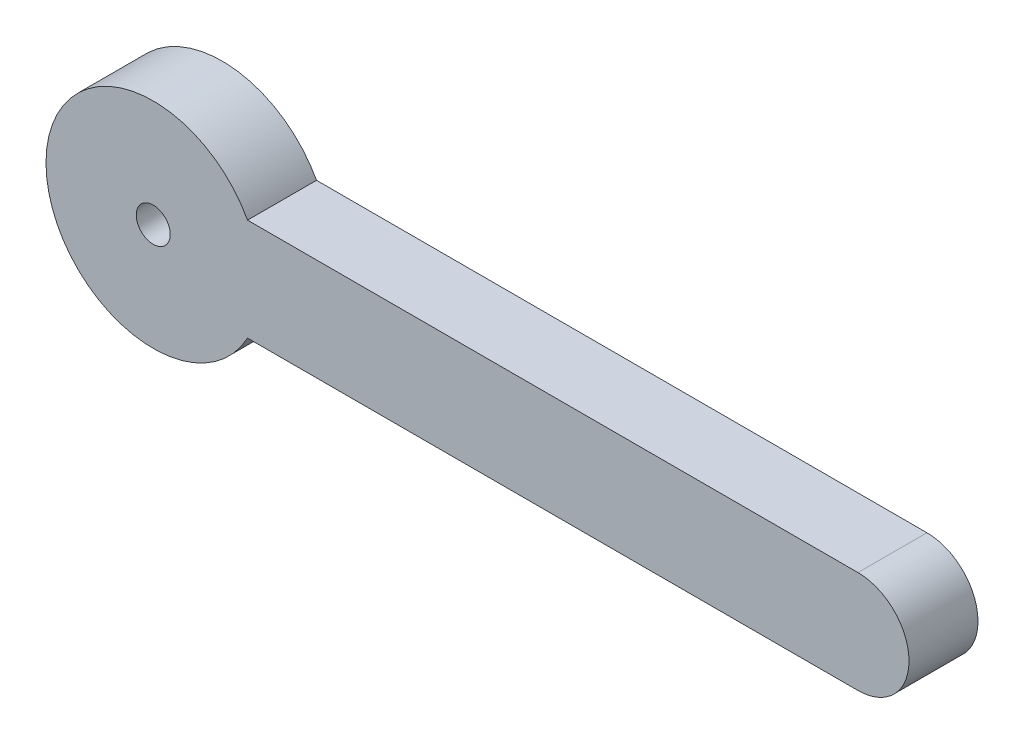
ISO-10303-21;
HEADER;
FILE_DESCRIPTION(('STEP AP214'),'2;1');
FILE_NAME('part.step','',(''),(''),'','','');
FILE_SCHEMA(('AUTOMOTIVE_DESIGN { 1 0 10303 214 1 1 1 1 }'));
ENDSEC;
DATA;
#1=APPLICATION_CONTEXT('core data for automotive mechanical design processes');
#2=APPLICATION_PROTOCOL_DEFINITION('international standard','automotive_design',2000,#1);
#3=PRODUCT_CONTEXT('',#1,'mechanical');
#4=PRODUCT('Part','Part','',(#3));
#5=PRODUCT_RELATED_PRODUCT_CATEGORY('part','',(#4));
#6=PRODUCT_DEFINITION_FORMATION('','',#4);
#7=PRODUCT_DEFINITION_CONTEXT('part definition',#1,'design');
#8=PRODUCT_DEFINITION('design','',#6,#7);
#9=PRODUCT_DEFINITION_SHAPE('','',#8);
#10=(LENGTH_UNIT() NAMED_UNIT(*) SI_UNIT(.MILLI.,.METRE.));
#11=(NAMED_UNIT(*) PLANE_ANGLE_UNIT() SI_UNIT($,.RADIAN.));
#12=(NAMED_UNIT(*) SI_UNIT($,.STERADIAN.) SOLID_ANGLE_UNIT());
#13=UNCERTAINTY_MEASURE_WITH_UNIT(LENGTH_MEASURE(1.E-05),#10,'distance_accuracy_value','');
#14=(GEOMETRIC_REPRESENTATION_CONTEXT(3) GLOBAL_UNCERTAINTY_ASSIGNED_CONTEXT((#13)) GLOBAL_UNIT_ASSIGNED_CONTEXT((#10,
#11,#12)) REPRESENTATION_CONTEXT('',''));
#15=CARTESIAN_POINT('',(0.,0.,0.));
#16=DIRECTION('',(0.,0.,1.));
#17=DIRECTION('',(1.,0.,0.));
#18=AXIS2_PLACEMENT_3D('',#15,#16,#17);
#19=CARTESIAN_POINT('',(102.163149927398,0.,10.));
#20=DIRECTION('',(0.,0.,-1.));
#21=DIRECTION('',(-1.,0.,0.));
#22=AXIS2_PLACEMENT_3D('',#19,#20,#21);
#23=CYLINDRICAL_SURFACE('',#22,7.40447109511266);
#24=CARTESIAN_POINT('',(102.163149927398,0.,0.));
#25=DIRECTION('',(0.,0.,1.));
#26=DIRECTION('',(1.,0.,0.));
#27=AXIS2_PLACEMENT_3D('',#24,#25,#26);
#28=CIRCLE('',#27,7.40447109511266);
#29=CARTESIAN_POINT('',(102.163149927398,7.40447109511266,0.));
#30=VERTEX_POINT('',#29);
#31=CARTESIAN_POINT('',(102.163149927398,-7.40447109511266,0.));
#32=VERTEX_POINT('',#31);
#33=EDGE_CURVE('E119',#30,#32,#28,.F.);
#34=ORIENTED_EDGE('',*,*,#33,.F.);
#35=DIRECTION('',(0.,0.,-1.));
#36=VECTOR('',#35,1.);
#37=CARTESIAN_POINT('',(102.163149927398,7.40447109511266,10.));
#38=LINE('',#37,#36);
#39=CARTESIAN_POINT('',(102.163149927398,7.40447109511266,10.));
#40=VERTEX_POINT('',#39);
#41=EDGE_CURVE('E11',#40,#30,#38,.T.);
#42=ORIENTED_EDGE('',*,*,#41,.F.);
#43=CARTESIAN_POINT('',(102.163149927398,0.,10.));
#44=DIRECTION('',(0.,0.,1.));
#45=DIRECTION('',(1.,0.,0.));
#46=AXIS2_PLACEMENT_3D('',#43,#44,#45);
#47=CIRCLE('',#46,7.40447109511266);
#48=CARTESIAN_POINT('',(102.163149927398,-7.40447109511266,10.));
#49=VERTEX_POINT('',#48);
#50=EDGE_CURVE('E109',#40,#49,#47,.F.);
#51=ORIENTED_EDGE('',*,*,#50,.T.);
#52=DIRECTION('',(0.,0.,-1.));
#53=VECTOR('',#52,1.);
#54=CARTESIAN_POINT('',(102.163149927398,-7.40447109511266,10.));
#55=LINE('',#54,#53);
#56=EDGE_CURVE('E87',#49,#32,#55,.T.);
#57=ORIENTED_EDGE('',*,*,#56,.T.);
#58=EDGE_LOOP('',(#34,#42,#51,#57));
#59=FACE_BOUND('',#58,.T.);
#60=ADVANCED_FACE('F47',(#59),#23,.T.);
#61=CARTESIAN_POINT('',(0.,7.40447109511266,10.));
#62=DIRECTION('',(0.,1.,0.));
#63=DIRECTION('',(0.,0.,1.));
#64=AXIS2_PLACEMENT_3D('',#61,#62,#63);
#65=PLANE('',#64);
#66=DIRECTION('',(1.,0.,0.));
#67=VECTOR('',#66,1.);
#68=CARTESIAN_POINT('',(0.,7.40447109511266,0.));
#69=LINE('',#68,#67);
#70=CARTESIAN_POINT('',(13.6702198873718,7.40447109511266,0.));
#71=VERTEX_POINT('',#70);
#72=EDGE_CURVE('E100',#71,#30,#69,.T.);
#73=ORIENTED_EDGE('',*,*,#72,.F.);
#74=DIRECTION('',(0.,0.,-1.));
#75=VECTOR('',#74,1.);
#76=CARTESIAN_POINT('',(13.6702198873718,7.40447109511266,10.));
#77=LINE('',#76,#75);
#78=CARTESIAN_POINT('',(13.6702198873718,7.40447109511266,10.));
#79=VERTEX_POINT('',#78);
#80=EDGE_CURVE('E57',#79,#71,#77,.T.);
#81=ORIENTED_EDGE('',*,*,#80,.F.);
#82=DIRECTION('',(1.,0.,0.));
#83=VECTOR('',#82,1.);
#84=CARTESIAN_POINT('',(0.,7.40447109511266,10.));
#85=LINE('',#84,#83);
#86=EDGE_CURVE('E98',#79,#40,#85,.T.);
#87=ORIENTED_EDGE('',*,*,#86,.T.);
#88=ORIENTED_EDGE('',*,*,#41,.T.);
#89=EDGE_LOOP('',(#73,#81,#87,#88));
#90=FACE_BOUND('',#89,.T.);
#91=ADVANCED_FACE('F96',(#90),#65,.T.);
#92=CARTESIAN_POINT('',(0.,0.,10.));
#93=DIRECTION('',(0.,0.,-1.));
#94=DIRECTION('',(-1.,0.,0.));
#95=AXIS2_PLACEMENT_3D('',#92,#93,#94);
#96=CYLINDRICAL_SURFACE('',#95,15.5467393355474);
#97=CARTESIAN_POINT('',(0.,0.,0.));
#98=DIRECTION('',(0.,0.,1.));
#99=DIRECTION('',(1.,0.,0.));
#100=AXIS2_PLACEMENT_3D('',#97,#98,#99);
#101=CIRCLE('',#100,15.5467393355474);
#102=CARTESIAN_POINT('',(13.6702198873718,-7.40447109511266,0.));
#103=VERTEX_POINT('',#102);
#104=EDGE_CURVE('E80',#71,#103,#101,.T.);
#105=ORIENTED_EDGE('',*,*,#104,.T.);
#106=DIRECTION('',(0.,0.,-1.));
#107=VECTOR('',#106,1.);
#108=CARTESIAN_POINT('',(13.6702198873718,-7.40447109511266,10.));
#109=LINE('',#108,#107);
#110=CARTESIAN_POINT('',(13.6702198873718,-7.40447109511266,10.));
#111=VERTEX_POINT('',#110);
#112=EDGE_CURVE('E102',#111,#103,#109,.T.);
#113=ORIENTED_EDGE('',*,*,#112,.F.);
#114=CARTESIAN_POINT('',(0.,0.,10.));
#115=DIRECTION('',(0.,0.,1.));
#116=DIRECTION('',(1.,0.,0.));
#117=AXIS2_PLACEMENT_3D('',#114,#115,#116);
#118=CIRCLE('',#117,15.5467393355474);
#119=EDGE_CURVE('E104',#79,#111,#118,.T.);
#120=ORIENTED_EDGE('',*,*,#119,.F.);
#121=ORIENTED_EDGE('',*,*,#80,.T.);
#122=EDGE_LOOP('',(#105,#113,#120,#121));
#123=FACE_BOUND('',#122,.T.);
#124=ADVANCED_FACE('F105',(#123),#96,.T.);
#125=CARTESIAN_POINT('',(0.,-7.40447109511266,10.));
#126=DIRECTION('',(0.,1.,0.));
#127=DIRECTION('',(0.,0.,1.));
#128=AXIS2_PLACEMENT_3D('',#125,#126,#127);
#129=PLANE('',#128);
#130=DIRECTION('',(1.,0.,0.));
#131=VECTOR('',#130,1.);
#132=CARTESIAN_POINT('',(0.,-7.40447109511266,0.));
#133=LINE('',#132,#131);
#134=EDGE_CURVE('E113',#103,#32,#133,.T.);
#135=ORIENTED_EDGE('',*,*,#134,.T.);
#136=ORIENTED_EDGE('',*,*,#56,.F.);
#137=DIRECTION('',(1.,0.,0.));
#138=VECTOR('',#137,1.);
#139=CARTESIAN_POINT('',(0.,-7.40447109511266,10.));
#140=LINE('',#139,#138);
#141=EDGE_CURVE('E65',#111,#49,#140,.T.);
#142=ORIENTED_EDGE('',*,*,#141,.F.);
#143=ORIENTED_EDGE('',*,*,#112,.T.);
#144=EDGE_LOOP('',(#135,#136,#142,#143));
#145=FACE_BOUND('',#144,.T.);
#146=ADVANCED_FACE('F134',(#145),#129,.F.);
#147=CARTESIAN_POINT('',(0.,0.,10.));
#148=DIRECTION('',(0.,0.,1.));
#149=DIRECTION('',(1.,0.,0.));
#150=AXIS2_PLACEMENT_3D('',#147,#148,#149);
#151=PLANE('',#150);
#152=CARTESIAN_POINT('',(0.,0.,10.));
#153=DIRECTION('',(0.,0.,1.));
#154=DIRECTION('',(1.,0.,0.));
#155=AXIS2_PLACEMENT_3D('',#152,#153,#154);
#156=CIRCLE('',#155,2.46676285534763);
#157=CARTESIAN_POINT('',(2.46676285534763,0.,10.));
#158=VERTEX_POINT('',#157);
#159=EDGE_CURVE('E173',#158,#158,#156,.T.);
#160=ORIENTED_EDGE('',*,*,#159,.F.);
#161=EDGE_LOOP('',(#160));
#162=FACE_BOUND('',#161,.T.);
#163=ORIENTED_EDGE('',*,*,#50,.F.);
#164=ORIENTED_EDGE('',*,*,#86,.F.);
#165=ORIENTED_EDGE('',*,*,#119,.T.);
#166=ORIENTED_EDGE('',*,*,#141,.T.);
#167=EDGE_LOOP('',(#163,#164,#165,#166));
#168=FACE_BOUND('',#167,.T.);
#169=ADVANCED_FACE('F108',(#162,#168),#151,.T.);
#170=CARTESIAN_POINT('',(0.,0.,0.));
#171=DIRECTION('',(0.,0.,1.));
#172=DIRECTION('',(1.,0.,0.));
#173=AXIS2_PLACEMENT_3D('',#170,#171,#172);
#174=PLANE('',#173);
#175=CARTESIAN_POINT('',(0.,0.,0.));
#176=DIRECTION('',(0.,0.,1.));
#177=DIRECTION('',(1.,0.,0.));
#178=AXIS2_PLACEMENT_3D('',#175,#176,#177);
#179=CIRCLE('',#178,8.12019639684375);
#180=CARTESIAN_POINT('',(8.12019639684375,0.,0.));
#181=VERTEX_POINT('',#180);
#182=EDGE_CURVE('E50',#181,#181,#179,.F.);
#183=ORIENTED_EDGE('',*,*,#182,.F.);
#184=EDGE_LOOP('',(#183));
#185=FACE_BOUND('',#184,.T.);
#186=ORIENTED_EDGE('',*,*,#33,.T.);
#187=ORIENTED_EDGE('',*,*,#134,.F.);
#188=ORIENTED_EDGE('',*,*,#104,.F.);
#189=ORIENTED_EDGE('',*,*,#72,.T.);
#190=EDGE_LOOP('',(#186,#187,#188,#189));
#191=FACE_BOUND('',#190,.T.);
#192=ADVANCED_FACE('F136',(#185,#191),#174,.F.);
#193=CARTESIAN_POINT('',(0.,0.,-1.2E-05));
#194=DIRECTION('',(0.,0.,1.));
#195=DIRECTION('',(1.,0.,0.));
#196=AXIS2_PLACEMENT_3D('',#193,#194,#195);
#197=CYLINDRICAL_SURFACE('',#196,8.12019639684375);
#198=CARTESIAN_POINT('',(0.,0.,5.));
#199=DIRECTION('',(0.,0.,-1.));
#200=DIRECTION('',(-1.,0.,0.));
#201=AXIS2_PLACEMENT_3D('',#198,#199,#200);
#202=CIRCLE('',#201,8.12019639684375);
#203=CARTESIAN_POINT('',(8.12019639684375,0.,5.));
#204=VERTEX_POINT('',#203);
#205=EDGE_CURVE('E177',#204,#204,#202,.T.);
#206=CARTESIAN_POINT('',(8.12019639684375,0.,5.));
#207=CARTESIAN_POINT('',(8.12019639684375,0.,4.94791666666667));
#208=CARTESIAN_POINT('',(8.12019639684375,0.,4.89583333333333));
#209=CARTESIAN_POINT('',(8.12019639684375,0.,4.79166666666667));
#210=CARTESIAN_POINT('',(8.12019639684375,0.,4.73958333333333));
#211=CARTESIAN_POINT('',(8.12019639684375,0.,4.63541666666667));
#212=CARTESIAN_POINT('',(8.12019639684375,0.,4.58333333333333));
#213=CARTESIAN_POINT('',(8.12019639684375,0.,4.47916666666667));
#214=CARTESIAN_POINT('',(8.12019639684375,0.,4.42708333333333));
#215=CARTESIAN_POINT('',(8.12019639684375,0.,4.32291666666667));
#216=CARTESIAN_POINT('',(8.12019639684375,0.,4.27083333333333));
#217=CARTESIAN_POINT('',(8.12019639684375,0.,4.16666666666667));
#218=CARTESIAN_POINT('',(8.12019639684375,0.,4.11458333333333));
#219=CARTESIAN_POINT('',(8.12019639684375,0.,4.01041666666667));
#220=CARTESIAN_POINT('',(8.12019639684375,0.,3.95833333333333));
#221=CARTESIAN_POINT('',(8.12019639684375,0.,3.85416666666667));
#222=CARTESIAN_POINT('',(8.12019639684375,0.,3.80208333333333));
#223=CARTESIAN_POINT('',(8.12019639684375,0.,3.69791666666667));
#224=CARTESIAN_POINT('',(8.12019639684375,0.,3.64583333333333));
#225=CARTESIAN_POINT('',(8.12019639684375,0.,3.54166666666667));
#226=CARTESIAN_POINT('',(8.12019639684375,0.,3.48958333333333));
#227=CARTESIAN_POINT('',(8.12019639684375,0.,3.38541666666667));
#228=CARTESIAN_POINT('',(8.12019639684375,0.,3.33333333333333));
#229=CARTESIAN_POINT('',(8.12019639684375,0.,3.22916666666667));
#230=CARTESIAN_POINT('',(8.12019639684375,0.,3.17708333333333));
#231=CARTESIAN_POINT('',(8.12019639684375,0.,3.07291666666667));
#232=CARTESIAN_POINT('',(8.12019639684375,0.,3.02083333333333));
#233=CARTESIAN_POINT('',(8.12019639684375,0.,2.91666666666667));
#234=CARTESIAN_POINT('',(8.12019639684375,0.,2.86458333333333));
#235=CARTESIAN_POINT('',(8.12019639684375,0.,2.76041666666667));
#236=CARTESIAN_POINT('',(8.12019639684375,0.,2.70833333333333));
#237=CARTESIAN_POINT('',(8.12019639684375,0.,2.60416666666667));
#238=CARTESIAN_POINT('',(8.12019639684375,0.,2.55208333333333));
#239=CARTESIAN_POINT('',(8.12019639684375,0.,2.44791666666667));
#240=CARTESIAN_POINT('',(8.12019639684375,0.,2.39583333333333));
#241=CARTESIAN_POINT('',(8.12019639684375,0.,2.29166666666667));
#242=CARTESIAN_POINT('',(8.12019639684375,0.,2.23958333333333));
#243=CARTESIAN_POINT('',(8.12019639684375,0.,2.13541666666667));
#244=CARTESIAN_POINT('',(8.12019639684375,0.,2.08333333333333));
#245=CARTESIAN_POINT('',(8.12019639684375,0.,1.97916666666667));
#246=CARTESIAN_POINT('',(8.12019639684375,0.,1.92708333333333));
#247=CARTESIAN_POINT('',(8.12019639684375,0.,1.82291666666667));
#248=CARTESIAN_POINT('',(8.12019639684375,0.,1.77083333333333));
#249=CARTESIAN_POINT('',(8.12019639684375,0.,1.66666666666667));
#250=CARTESIAN_POINT('',(8.12019639684375,0.,1.61458333333333));
#251=CARTESIAN_POINT('',(8.12019639684375,0.,1.51041666666667));
#252=CARTESIAN_POINT('',(8.12019639684375,0.,1.45833333333333));
#253=CARTESIAN_POINT('',(8.12019639684375,0.,1.35416666666667));
#254=CARTESIAN_POINT('',(8.12019639684375,0.,1.30208333333333));
#255=CARTESIAN_POINT('',(8.12019639684375,0.,1.19791666666667));
#256=CARTESIAN_POINT('',(8.12019639684375,0.,1.14583333333333));
#257=CARTESIAN_POINT('',(8.12019639684375,0.,1.04166666666667));
#258=CARTESIAN_POINT('',(8.12019639684375,0.,0.989583333333333));
#259=CARTESIAN_POINT('',(8.12019639684375,0.,0.885416666666667));
#260=CARTESIAN_POINT('',(8.12019639684375,0.,0.833333333333333));
#261=CARTESIAN_POINT('',(8.12019639684375,0.,0.729166666666667));
#262=CARTESIAN_POINT('',(8.12019639684375,0.,0.677083333333334));
#263=CARTESIAN_POINT('',(8.12019639684375,0.,0.572916666666667));
#264=CARTESIAN_POINT('',(8.12019639684375,0.,0.520833333333333));
#265=CARTESIAN_POINT('',(8.12019639684375,0.,0.416666666666667));
#266=CARTESIAN_POINT('',(8.12019639684375,0.,0.364583333333333));
#267=CARTESIAN_POINT('',(8.12019639684375,0.,0.260416666666667));
#268=CARTESIAN_POINT('',(8.12019639684375,0.,0.208333333333333));
#269=CARTESIAN_POINT('',(8.12019639684375,0.,0.104166666666667));
#270=CARTESIAN_POINT('',(8.12019639684375,0.,0.0520833333333332));
#271=CARTESIAN_POINT('',(8.12019639684375,0.,0.));
#272=B_SPLINE_CURVE_WITH_KNOTS('',3,(#206,#207,#208,#209,#210,#211,#212,#213,#214,#215,#216,
#217,#218,#219,#220,#221,#222,#223,#224,#225,#226,#227,#228,#229,#230,#231,#232,#233,#234,#235,
#236,#237,#238,#239,#240,#241,#242,#243,#244,#245,#246,#247,#248,#249,#250,#251,#252,#253,#254,
#255,#256,#257,#258,#259,#260,#261,#262,#263,#264,#265,#266,#267,#268,#269,#270,#271),
.UNSPECIFIED.,.F.,.F.,(4,2,2,2,2,2,2,2,2,2,2,2,2,2,2,2,2,2,2,2,2,2,2,2,2,2,2,2,2,2,2,2,4),(0.,
0.15625,0.3125,0.46875,0.625000000000001,0.781250000000001,0.937500000000001,1.09375,1.25,
1.40625,1.5625,1.71875,1.875,2.03125,2.1875,2.34375,2.5,2.65625,2.8125,2.96875,3.125,3.28125,
3.4375,3.59375,3.75,3.90625,4.0625,4.21875,4.375,4.53125,4.6875,4.84375,5.),.UNSPECIFIED.);
#273=EDGE_CURVE('BSEAM150',#204,#181,#272,.T.);
#274=ORIENTED_EDGE('',*,*,#205,.F.);
#275=ORIENTED_EDGE('',*,*,#182,.T.);
#276=ORIENTED_EDGE('',*,*,#273,.T.);
#277=ORIENTED_EDGE('',*,*,#273,.F.);
#278=EDGE_LOOP('',(#274,#276,#275,#277));
#279=FACE_BOUND('',#278,.T.);
#280=ADVANCED_FACE('F150',(#279),#197,.F.);
#281=CARTESIAN_POINT('',(0.,0.,5.));
#282=DIRECTION('',(0.,0.,-1.));
#283=DIRECTION('',(-1.,0.,0.));
#284=AXIS2_PLACEMENT_3D('',#281,#282,#283);
#285=PLANE('',#284);
#286=CARTESIAN_POINT('',(0.,0.,5.));
#287=DIRECTION('',(0.,0.,1.));
#288=DIRECTION('',(1.,0.,0.));
#289=AXIS2_PLACEMENT_3D('',#286,#287,#288);
#290=CIRCLE('',#289,2.46676285534763);
#291=CARTESIAN_POINT('',(2.46676285534763,0.,5.));
#292=VERTEX_POINT('',#291);
#293=EDGE_CURVE('E170',#292,#292,#290,.T.);
#294=ORIENTED_EDGE('',*,*,#293,.T.);
#295=EDGE_LOOP('',(#294));
#296=FACE_BOUND('',#295,.T.);
#297=ORIENTED_EDGE('',*,*,#205,.T.);
#298=EDGE_LOOP('',(#297));
#299=FACE_BOUND('',#298,.T.);
#300=ADVANCED_FACE('F157',(#296,#299),#285,.T.);
#301=CARTESIAN_POINT('',(0.,0.,5.));
#302=DIRECTION('',(0.,0.,1.));
#303=DIRECTION('',(1.,0.,0.));
#304=AXIS2_PLACEMENT_3D('',#301,#302,#303);
#305=CYLINDRICAL_SURFACE('',#304,2.46676285534763);
#306=ORIENTED_EDGE('',*,*,#293,.F.);
#307=EDGE_LOOP('',(#306));
#308=FACE_BOUND('',#307,.T.);
#309=ORIENTED_EDGE('',*,*,#159,.T.);
#310=EDGE_LOOP('',(#309));
#311=FACE_BOUND('',#310,.T.);
#312=ADVANCED_FACE('F161',(#308,#311),#305,.F.);
#313=CLOSED_SHELL('',(#60,#91,#124,#146,#169,#192,#280,#300,#312));
#314=MANIFOLD_SOLID_BREP('B2',#313);
#315=ADVANCED_BREP_SHAPE_REPRESENTATION('',(#18,#314),#14);
#316=SHAPE_DEFINITION_REPRESENTATION(#9,#315);
ENDSEC;
END-ISO-10303-21;
